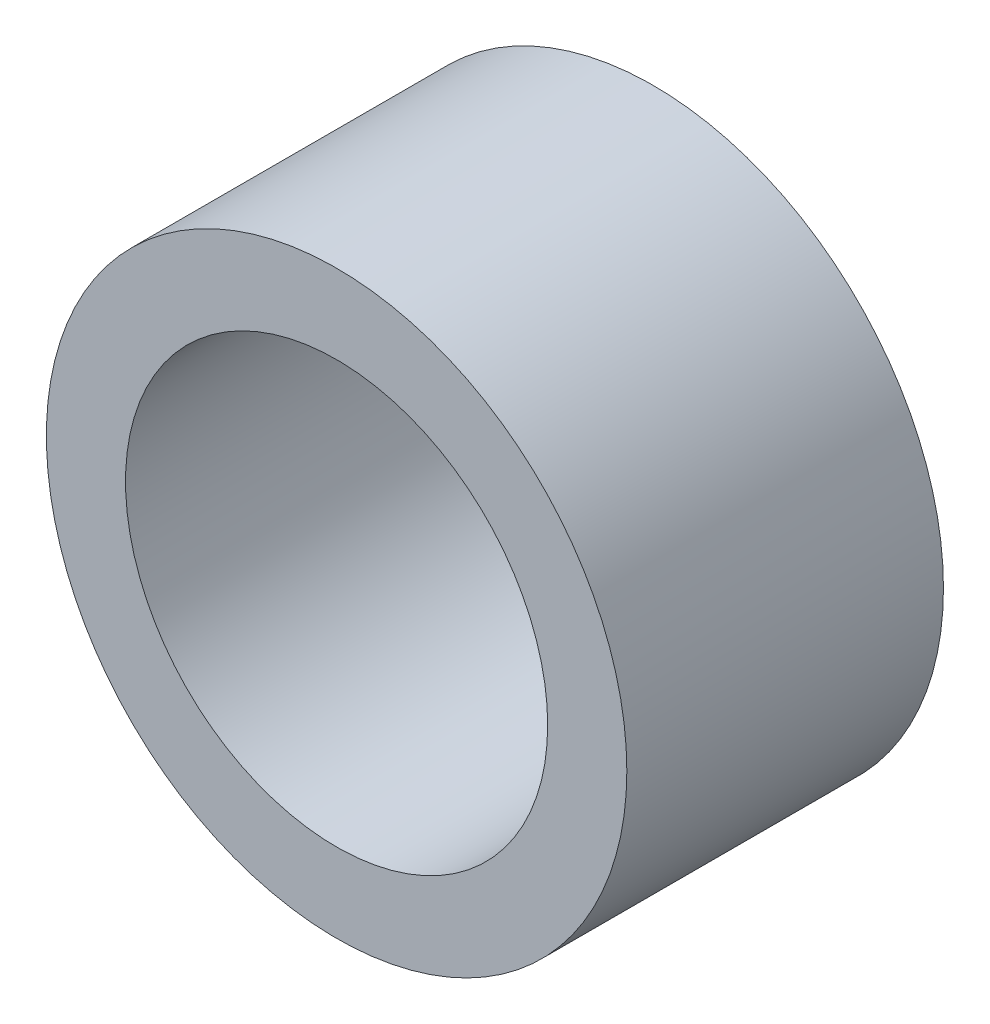
ISO-10303-21;
HEADER;
FILE_DESCRIPTION(('STEP AP214'),'2;1');
FILE_NAME('part.step','',(''),(''),'','','');
FILE_SCHEMA(('AUTOMOTIVE_DESIGN { 1 0 10303 214 1 1 1 1 }'));
ENDSEC;
DATA;
#1=APPLICATION_CONTEXT('core data for automotive mechanical design processes');
#2=APPLICATION_PROTOCOL_DEFINITION('international standard','automotive_design',2000,#1);
#3=PRODUCT_CONTEXT('',#1,'mechanical');
#4=PRODUCT('Part','Part','',(#3));
#5=PRODUCT_RELATED_PRODUCT_CATEGORY('part','',(#4));
#6=PRODUCT_DEFINITION_FORMATION('','',#4);
#7=PRODUCT_DEFINITION_CONTEXT('part definition',#1,'design');
#8=PRODUCT_DEFINITION('design','',#6,#7);
#9=PRODUCT_DEFINITION_SHAPE('','',#8);
#10=(LENGTH_UNIT() NAMED_UNIT(*) SI_UNIT(.MILLI.,.METRE.));
#11=(NAMED_UNIT(*) PLANE_ANGLE_UNIT() SI_UNIT($,.RADIAN.));
#12=(NAMED_UNIT(*) SI_UNIT($,.STERADIAN.) SOLID_ANGLE_UNIT());
#13=UNCERTAINTY_MEASURE_WITH_UNIT(LENGTH_MEASURE(1.E-05),#10,'distance_accuracy_value','');
#14=(GEOMETRIC_REPRESENTATION_CONTEXT(3) GLOBAL_UNCERTAINTY_ASSIGNED_CONTEXT((#13)) GLOBAL_UNIT_ASSIGNED_CONTEXT((#10,
#11,#12)) REPRESENTATION_CONTEXT('',''));
#15=CARTESIAN_POINT('',(0.,0.,0.));
#16=DIRECTION('',(0.,0.,1.));
#17=DIRECTION('',(1.,0.,0.));
#18=AXIS2_PLACEMENT_3D('',#15,#16,#17);
#19=CARTESIAN_POINT('',(0.,0.,12.));
#20=DIRECTION('',(0.,0.,1.));
#21=DIRECTION('',(1.,0.,0.));
#22=AXIS2_PLACEMENT_3D('',#19,#20,#21);
#23=PLANE('',#22);
#24=CARTESIAN_POINT('',(0.,0.,12.));
#25=DIRECTION('',(0.,0.,1.));
#26=DIRECTION('',(1.,0.,0.));
#27=AXIS2_PLACEMENT_3D('',#24,#25,#26);
#28=CIRCLE('',#27,11.);
#29=CARTESIAN_POINT('',(11.,0.,12.));
#30=VERTEX_POINT('',#29);
#31=EDGE_CURVE('E10',#30,#30,#28,.T.);
#32=ORIENTED_EDGE('',*,*,#31,.T.);
#33=EDGE_LOOP('',(#32));
#34=FACE_BOUND('',#33,.T.);
#35=CARTESIAN_POINT('',(0.,0.,12.));
#36=DIRECTION('',(0.,0.,1.));
#37=DIRECTION('',(1.,0.,0.));
#38=AXIS2_PLACEMENT_3D('',#35,#36,#37);
#39=CIRCLE('',#38,8.);
#40=CARTESIAN_POINT('',(8.,0.,12.));
#41=VERTEX_POINT('',#40);
#42=EDGE_CURVE('E46',#41,#41,#39,.T.);
#43=ORIENTED_EDGE('',*,*,#42,.F.);
#44=EDGE_LOOP('',(#43));
#45=FACE_BOUND('',#44,.T.);
#46=ADVANCED_FACE('F35',(#34,#45),#23,.T.);
#47=CARTESIAN_POINT('',(0.,0.,0.));
#48=DIRECTION('',(0.,0.,1.));
#49=DIRECTION('',(1.,0.,0.));
#50=AXIS2_PLACEMENT_3D('',#47,#48,#49);
#51=PLANE('',#50);
#52=CARTESIAN_POINT('',(0.,0.,0.));
#53=DIRECTION('',(0.,0.,1.));
#54=DIRECTION('',(1.,0.,0.));
#55=AXIS2_PLACEMENT_3D('',#52,#53,#54);
#56=CIRCLE('',#55,11.);
#57=CARTESIAN_POINT('',(11.,0.,0.));
#58=VERTEX_POINT('',#57);
#59=EDGE_CURVE('E39',#58,#58,#56,.T.);
#60=ORIENTED_EDGE('',*,*,#59,.F.);
#61=EDGE_LOOP('',(#60));
#62=FACE_BOUND('',#61,.T.);
#63=CARTESIAN_POINT('',(0.,0.,0.));
#64=DIRECTION('',(0.,0.,1.));
#65=DIRECTION('',(1.,0.,0.));
#66=AXIS2_PLACEMENT_3D('',#63,#64,#65);
#67=CIRCLE('',#66,8.);
#68=CARTESIAN_POINT('',(8.,0.,0.));
#69=VERTEX_POINT('',#68);
#70=EDGE_CURVE('E48',#69,#69,#67,.T.);
#71=ORIENTED_EDGE('',*,*,#70,.T.);
#72=EDGE_LOOP('',(#71));
#73=FACE_BOUND('',#72,.T.);
#74=ADVANCED_FACE('F58',(#62,#73),#51,.F.);
#75=CARTESIAN_POINT('',(0.,0.,12.));
#76=DIRECTION('',(0.,0.,-1.));
#77=DIRECTION('',(-1.,0.,0.));
#78=AXIS2_PLACEMENT_3D('',#75,#76,#77);
#79=CYLINDRICAL_SURFACE('',#78,11.);
#80=ORIENTED_EDGE('',*,*,#31,.F.);
#81=EDGE_LOOP('',(#80));
#82=FACE_BOUND('',#81,.T.);
#83=ORIENTED_EDGE('',*,*,#59,.T.);
#84=EDGE_LOOP('',(#83));
#85=FACE_BOUND('',#84,.T.);
#86=ADVANCED_FACE('F37',(#82,#85),#79,.T.);
#87=CARTESIAN_POINT('',(0.,0.,12.));
#88=DIRECTION('',(0.,0.,-1.));
#89=DIRECTION('',(-1.,0.,0.));
#90=AXIS2_PLACEMENT_3D('',#87,#88,#89);
#91=CYLINDRICAL_SURFACE('',#90,8.);
#92=ORIENTED_EDGE('',*,*,#42,.T.);
#93=EDGE_LOOP('',(#92));
#94=FACE_BOUND('',#93,.T.);
#95=ORIENTED_EDGE('',*,*,#70,.F.);
#96=EDGE_LOOP('',(#95));
#97=FACE_BOUND('',#96,.T.);
#98=ADVANCED_FACE('F54',(#94,#97),#91,.F.);
#99=CLOSED_SHELL('',(#46,#74,#86,#98));
#100=MANIFOLD_SOLID_BREP('B2',#99);
#101=ADVANCED_BREP_SHAPE_REPRESENTATION('',(#18,#100),#14);
#102=SHAPE_DEFINITION_REPRESENTATION(#9,#101);
ENDSEC;
END-ISO-10303-21;
